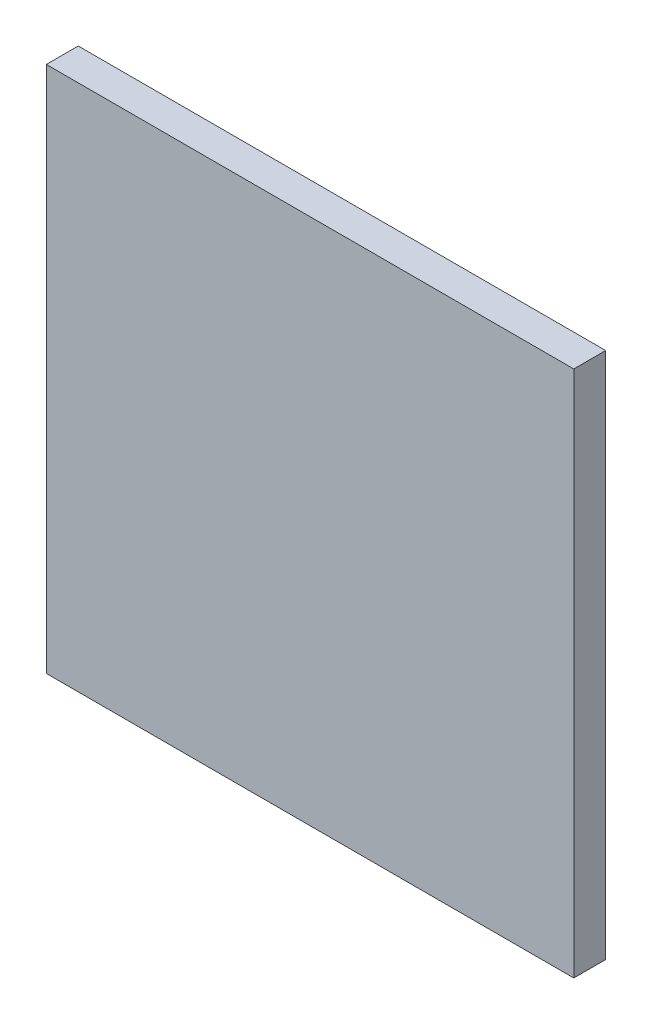
ISO-10303-21;
HEADER;
FILE_DESCRIPTION(('STEP AP214'),'2;1');
FILE_NAME('part.step','',(''),(''),'','','');
FILE_SCHEMA(('AUTOMOTIVE_DESIGN { 1 0 10303 214 1 1 1 1 }'));
ENDSEC;
DATA;
#1=APPLICATION_CONTEXT('core data for automotive mechanical design processes');
#2=APPLICATION_PROTOCOL_DEFINITION('international standard','automotive_design',2000,#1);
#3=PRODUCT_CONTEXT('',#1,'mechanical');
#4=PRODUCT('Part','Part','',(#3));
#5=PRODUCT_RELATED_PRODUCT_CATEGORY('part','',(#4));
#6=PRODUCT_DEFINITION_FORMATION('','',#4);
#7=PRODUCT_DEFINITION_CONTEXT('part definition',#1,'design');
#8=PRODUCT_DEFINITION('design','',#6,#7);
#9=PRODUCT_DEFINITION_SHAPE('','',#8);
#10=(LENGTH_UNIT() NAMED_UNIT(*) SI_UNIT(.MILLI.,.METRE.));
#11=(NAMED_UNIT(*) PLANE_ANGLE_UNIT() SI_UNIT($,.RADIAN.));
#12=(NAMED_UNIT(*) SI_UNIT($,.STERADIAN.) SOLID_ANGLE_UNIT());
#13=UNCERTAINTY_MEASURE_WITH_UNIT(LENGTH_MEASURE(1.E-05),#10,'distance_accuracy_value','');
#14=(GEOMETRIC_REPRESENTATION_CONTEXT(3) GLOBAL_UNCERTAINTY_ASSIGNED_CONTEXT((#13)) GLOBAL_UNIT_ASSIGNED_CONTEXT((#10,
#11,#12)) REPRESENTATION_CONTEXT('',''));
#15=CARTESIAN_POINT('',(0.,0.,0.));
#16=DIRECTION('',(0.,0.,1.));
#17=DIRECTION('',(1.,0.,0.));
#18=AXIS2_PLACEMENT_3D('',#15,#16,#17);
#19=CARTESIAN_POINT('',(3.15,-3.15,0.381));
#20=DIRECTION('',(-1.,0.,0.));
#21=DIRECTION('',(0.,0.,1.));
#22=AXIS2_PLACEMENT_3D('',#19,#20,#21);
#23=PLANE('',#22);
#24=DIRECTION('',(0.,1.,0.));
#25=VECTOR('',#24,1.);
#26=CARTESIAN_POINT('',(3.15,-3.15,0.));
#27=LINE('',#26,#25);
#28=CARTESIAN_POINT('',(3.15,-3.15,0.));
#29=VERTEX_POINT('',#28);
#30=CARTESIAN_POINT('',(3.15,3.15,0.));
#31=VERTEX_POINT('',#30);
#32=EDGE_CURVE('E102',#29,#31,#27,.T.);
#33=ORIENTED_EDGE('',*,*,#32,.T.);
#34=DIRECTION('',(0.,0.,-1.));
#35=VECTOR('',#34,1.);
#36=CARTESIAN_POINT('',(3.15,3.15,0.381));
#37=LINE('',#36,#35);
#38=CARTESIAN_POINT('',(3.15,3.15,0.381));
#39=VERTEX_POINT('',#38);
#40=EDGE_CURVE('E11',#39,#31,#37,.T.);
#41=ORIENTED_EDGE('',*,*,#40,.F.);
#42=DIRECTION('',(0.,1.,0.));
#43=VECTOR('',#42,1.);
#44=CARTESIAN_POINT('',(3.15,-3.15,0.381));
#45=LINE('',#44,#43);
#46=CARTESIAN_POINT('',(3.15,-3.15,0.381));
#47=VERTEX_POINT('',#46);
#48=EDGE_CURVE('E90',#47,#39,#45,.T.);
#49=ORIENTED_EDGE('',*,*,#48,.F.);
#50=DIRECTION('',(0.,0.,-1.));
#51=VECTOR('',#50,1.);
#52=CARTESIAN_POINT('',(3.15,-3.15,0.381));
#53=LINE('',#52,#51);
#54=EDGE_CURVE('E98',#47,#29,#53,.T.);
#55=ORIENTED_EDGE('',*,*,#54,.T.);
#56=EDGE_LOOP('',(#33,#41,#49,#55));
#57=FACE_BOUND('',#56,.T.);
#58=ADVANCED_FACE('F39',(#57),#23,.F.);
#59=CARTESIAN_POINT('',(-3.15,3.15,0.381));
#60=DIRECTION('',(0.,-1.,0.));
#61=DIRECTION('',(0.,0.,-1.));
#62=AXIS2_PLACEMENT_3D('',#59,#60,#61);
#63=PLANE('',#62);
#64=DIRECTION('',(-1.,0.,0.));
#65=VECTOR('',#64,1.);
#66=CARTESIAN_POINT('',(-3.15,3.15,0.));
#67=LINE('',#66,#65);
#68=CARTESIAN_POINT('',(-3.15,3.15,0.));
#69=VERTEX_POINT('',#68);
#70=EDGE_CURVE('E94',#31,#69,#67,.T.);
#71=ORIENTED_EDGE('',*,*,#70,.T.);
#72=DIRECTION('',(0.,0.,-1.));
#73=VECTOR('',#72,1.);
#74=CARTESIAN_POINT('',(-3.15,3.15,0.381));
#75=LINE('',#74,#73);
#76=CARTESIAN_POINT('',(-3.15,3.15,0.381));
#77=VERTEX_POINT('',#76);
#78=EDGE_CURVE('E47',#77,#69,#75,.T.);
#79=ORIENTED_EDGE('',*,*,#78,.F.);
#80=DIRECTION('',(-1.,0.,0.));
#81=VECTOR('',#80,1.);
#82=CARTESIAN_POINT('',(-3.15,3.15,0.381));
#83=LINE('',#82,#81);
#84=EDGE_CURVE('E85',#39,#77,#83,.T.);
#85=ORIENTED_EDGE('',*,*,#84,.F.);
#86=ORIENTED_EDGE('',*,*,#40,.T.);
#87=EDGE_LOOP('',(#71,#79,#85,#86));
#88=FACE_BOUND('',#87,.T.);
#89=ADVANCED_FACE('F93',(#88),#63,.F.);
#90=CARTESIAN_POINT('',(-3.15,-3.15,0.381));
#91=DIRECTION('',(1.,0.,0.));
#92=DIRECTION('',(0.,0.,-1.));
#93=AXIS2_PLACEMENT_3D('',#90,#91,#92);
#94=PLANE('',#93);
#95=DIRECTION('',(0.,-1.,0.));
#96=VECTOR('',#95,1.);
#97=CARTESIAN_POINT('',(-3.15,-3.15,0.));
#98=LINE('',#97,#96);
#99=CARTESIAN_POINT('',(-3.15,-3.15,0.));
#100=VERTEX_POINT('',#99);
#101=EDGE_CURVE('E72',#69,#100,#98,.T.);
#102=ORIENTED_EDGE('',*,*,#101,.T.);
#103=DIRECTION('',(0.,0.,-1.));
#104=VECTOR('',#103,1.);
#105=CARTESIAN_POINT('',(-3.15,-3.15,0.381));
#106=LINE('',#105,#104);
#107=CARTESIAN_POINT('',(-3.15,-3.15,0.381));
#108=VERTEX_POINT('',#107);
#109=EDGE_CURVE('E95',#108,#100,#106,.T.);
#110=ORIENTED_EDGE('',*,*,#109,.F.);
#111=DIRECTION('',(0.,-1.,0.));
#112=VECTOR('',#111,1.);
#113=CARTESIAN_POINT('',(-3.15,-3.15,0.381));
#114=LINE('',#113,#112);
#115=EDGE_CURVE('E88',#77,#108,#114,.T.);
#116=ORIENTED_EDGE('',*,*,#115,.F.);
#117=ORIENTED_EDGE('',*,*,#78,.T.);
#118=EDGE_LOOP('',(#102,#110,#116,#117));
#119=FACE_BOUND('',#118,.T.);
#120=ADVANCED_FACE('F96',(#119),#94,.F.);
#121=CARTESIAN_POINT('',(-3.15,-3.15,0.381));
#122=DIRECTION('',(0.,1.,0.));
#123=DIRECTION('',(0.,0.,1.));
#124=AXIS2_PLACEMENT_3D('',#121,#122,#123);
#125=PLANE('',#124);
#126=DIRECTION('',(1.,0.,0.));
#127=VECTOR('',#126,1.);
#128=CARTESIAN_POINT('',(-3.15,-3.15,0.));
#129=LINE('',#128,#127);
#130=EDGE_CURVE('E78',#100,#29,#129,.T.);
#131=ORIENTED_EDGE('',*,*,#130,.T.);
#132=ORIENTED_EDGE('',*,*,#54,.F.);
#133=DIRECTION('',(1.,0.,0.));
#134=VECTOR('',#133,1.);
#135=CARTESIAN_POINT('',(-3.15,-3.15,0.381));
#136=LINE('',#135,#134);
#137=EDGE_CURVE('E55',#108,#47,#136,.T.);
#138=ORIENTED_EDGE('',*,*,#137,.F.);
#139=ORIENTED_EDGE('',*,*,#109,.T.);
#140=EDGE_LOOP('',(#131,#132,#138,#139));
#141=FACE_BOUND('',#140,.T.);
#142=ADVANCED_FACE('F109',(#141),#125,.F.);
#143=CARTESIAN_POINT('',(0.,0.,0.381));
#144=DIRECTION('',(0.,0.,-1.));
#145=DIRECTION('',(-1.,0.,0.));
#146=AXIS2_PLACEMENT_3D('',#143,#144,#145);
#147=PLANE('',#146);
#148=ORIENTED_EDGE('',*,*,#48,.T.);
#149=ORIENTED_EDGE('',*,*,#84,.T.);
#150=ORIENTED_EDGE('',*,*,#115,.T.);
#151=ORIENTED_EDGE('',*,*,#137,.T.);
#152=EDGE_LOOP('',(#148,#149,#150,#151));
#153=FACE_BOUND('',#152,.T.);
#154=ADVANCED_FACE('F86',(#153),#147,.F.);
#155=CARTESIAN_POINT('',(0.,0.,0.));
#156=DIRECTION('',(0.,0.,-1.));
#157=DIRECTION('',(-1.,0.,0.));
#158=AXIS2_PLACEMENT_3D('',#155,#156,#157);
#159=PLANE('',#158);
#160=ORIENTED_EDGE('',*,*,#32,.F.);
#161=ORIENTED_EDGE('',*,*,#130,.F.);
#162=ORIENTED_EDGE('',*,*,#101,.F.);
#163=ORIENTED_EDGE('',*,*,#70,.F.);
#164=EDGE_LOOP('',(#160,#161,#162,#163));
#165=FACE_BOUND('',#164,.T.);
#166=ADVANCED_FACE('F112',(#165),#159,.T.);
#167=CLOSED_SHELL('',(#58,#89,#120,#142,#154,#166));
#168=MANIFOLD_SOLID_BREP('B2',#167);
#169=ADVANCED_BREP_SHAPE_REPRESENTATION('',(#18,#168),#14);
#170=SHAPE_DEFINITION_REPRESENTATION(#9,#169);
ENDSEC;
END-ISO-10303-21;
